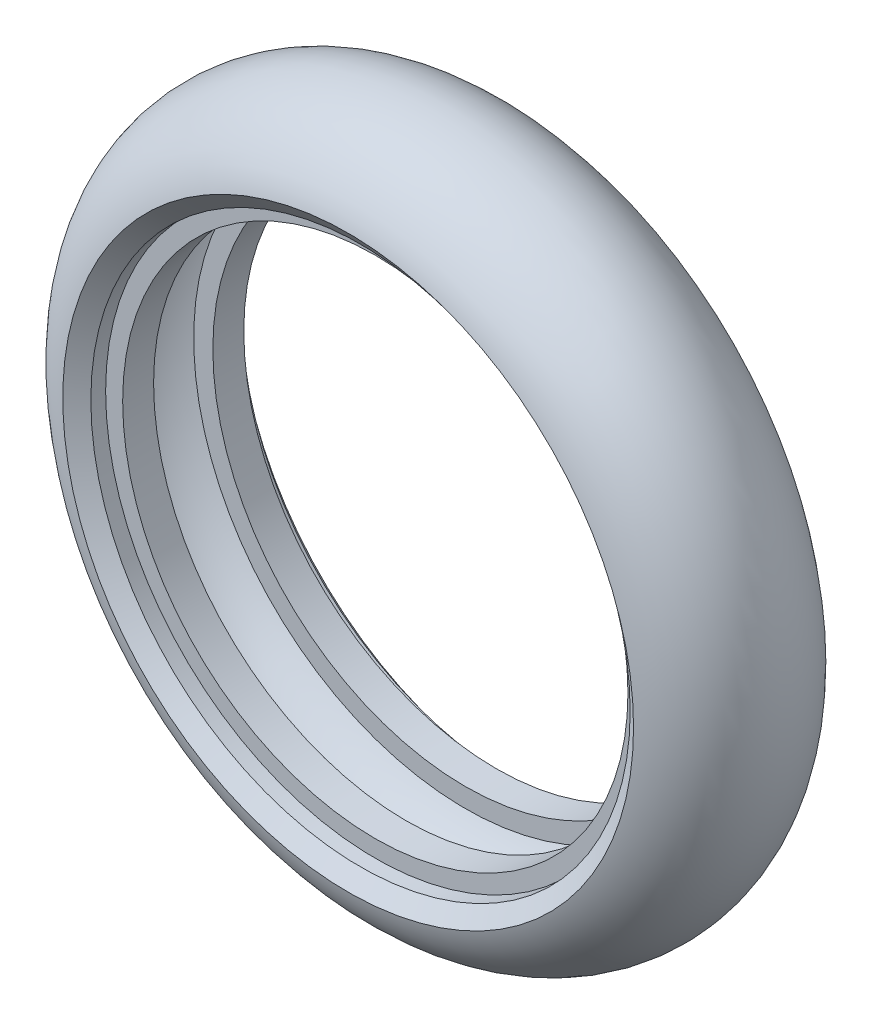
ISO-10303-21;
HEADER;
FILE_DESCRIPTION(('STEP AP214'),'2;1');
FILE_NAME('part.step','',(''),(''),'','','');
FILE_SCHEMA(('AUTOMOTIVE_DESIGN { 1 0 10303 214 1 1 1 1 }'));
ENDSEC;
DATA;
#1=APPLICATION_CONTEXT('core data for automotive mechanical design processes');
#2=APPLICATION_PROTOCOL_DEFINITION('international standard','automotive_design',2000,#1);
#3=PRODUCT_CONTEXT('',#1,'mechanical');
#4=PRODUCT('Part','Part','',(#3));
#5=PRODUCT_RELATED_PRODUCT_CATEGORY('part','',(#4));
#6=PRODUCT_DEFINITION_FORMATION('','',#4);
#7=PRODUCT_DEFINITION_CONTEXT('part definition',#1,'design');
#8=PRODUCT_DEFINITION('design','',#6,#7);
#9=PRODUCT_DEFINITION_SHAPE('','',#8);
#10=(LENGTH_UNIT() NAMED_UNIT(*) SI_UNIT(.MILLI.,.METRE.));
#11=(NAMED_UNIT(*) PLANE_ANGLE_UNIT() SI_UNIT($,.RADIAN.));
#12=(NAMED_UNIT(*) SI_UNIT($,.STERADIAN.) SOLID_ANGLE_UNIT());
#13=UNCERTAINTY_MEASURE_WITH_UNIT(LENGTH_MEASURE(1.E-05),#10,'distance_accuracy_value','');
#14=(GEOMETRIC_REPRESENTATION_CONTEXT(3) GLOBAL_UNCERTAINTY_ASSIGNED_CONTEXT((#13)) GLOBAL_UNIT_ASSIGNED_CONTEXT((#10,
#11,#12)) REPRESENTATION_CONTEXT('',''));
#15=CARTESIAN_POINT('',(0.,0.,0.));
#16=DIRECTION('',(0.,0.,1.));
#17=DIRECTION('',(1.,0.,0.));
#18=AXIS2_PLACEMENT_3D('',#15,#16,#17);
#19=CARTESIAN_POINT('',(0.,40.9970238095238,0.));
#20=DIRECTION('',(0.,0.,1.));
#21=DIRECTION('',(1.,0.,0.));
#22=AXIS2_PLACEMENT_3D('',#19,#20,#21);
#23=TOROIDAL_SURFACE('',#22,40.9970238095238,14.2529761904761);
#24=CARTESIAN_POINT('',(0.,40.9970238095238,-13.75));
#25=DIRECTION('',(0.,0.,1.));
#26=DIRECTION('',(1.,0.,0.));
#27=AXIS2_PLACEMENT_3D('',#24,#25,#26);
#28=CIRCLE('',#27,44.7499999999999);
#29=CARTESIAN_POINT('',(44.7499999999999,40.9970238095238,-13.75));
#30=VERTEX_POINT('',#29);
#31=EDGE_CURVE('E10',#30,#30,#28,.T.);
#32=ORIENTED_EDGE('',*,*,#31,.T.);
#33=EDGE_LOOP('',(#32));
#34=FACE_BOUND('',#33,.T.);
#35=CARTESIAN_POINT('',(0.,40.9970238095238,13.75));
#36=DIRECTION('',(0.,0.,1.));
#37=DIRECTION('',(1.,0.,0.));
#38=AXIS2_PLACEMENT_3D('',#35,#36,#37);
#39=CIRCLE('',#38,44.7499999999999);
#40=CARTESIAN_POINT('',(44.7499999999999,40.9970238095238,13.75));
#41=VERTEX_POINT('',#40);
#42=EDGE_CURVE('E84',#41,#41,#39,.T.);
#43=ORIENTED_EDGE('',*,*,#42,.F.);
#44=EDGE_LOOP('',(#43));
#45=FACE_BOUND('',#44,.T.);
#46=ADVANCED_FACE('F32',(#34,#45),#23,.T.);
#47=CARTESIAN_POINT('',(0.,40.9970238095238,-13.75));
#48=DIRECTION('',(0.,0.,-1.));
#49=DIRECTION('',(-1.,0.,0.));
#50=AXIS2_PLACEMENT_3D('',#47,#48,#49);
#51=CONICAL_SURFACE('',#50,44.7499999999999,0.905275158209152);
#52=CARTESIAN_POINT('',(0.,40.9970238095238,-11.815));
#53=DIRECTION('',(0.,0.,1.));
#54=DIRECTION('',(1.,0.,0.));
#55=AXIS2_PLACEMENT_3D('',#52,#53,#54);
#56=CIRCLE('',#55,42.285);
#57=CARTESIAN_POINT('',(42.285,40.9970238095238,-11.815));
#58=VERTEX_POINT('',#57);
#59=EDGE_CURVE('E38',#58,#58,#56,.T.);
#60=ORIENTED_EDGE('',*,*,#59,.T.);
#61=EDGE_LOOP('',(#60));
#62=FACE_BOUND('',#61,.T.);
#63=ORIENTED_EDGE('',*,*,#31,.F.);
#64=EDGE_LOOP('',(#63));
#65=FACE_BOUND('',#64,.T.);
#66=ADVANCED_FACE('F92',(#62,#65),#51,.F.);
#67=CARTESIAN_POINT('',(0.,40.9970238095238,83.1369947680119));
#68=DIRECTION('',(0.,0.,1.));
#69=DIRECTION('',(1.,0.,0.));
#70=AXIS2_PLACEMENT_3D('',#67,#68,#69);
#71=CYLINDRICAL_SURFACE('',#70,42.285);
#72=CARTESIAN_POINT('',(0.,40.9970238095238,-9.495));
#73=DIRECTION('',(0.,0.,1.));
#74=DIRECTION('',(1.,0.,0.));
#75=AXIS2_PLACEMENT_3D('',#72,#73,#74);
#76=CIRCLE('',#75,42.285);
#77=CARTESIAN_POINT('',(42.285,40.9970238095238,-9.495));
#78=VERTEX_POINT('',#77);
#79=EDGE_CURVE('E42',#78,#78,#76,.T.);
#80=ORIENTED_EDGE('',*,*,#79,.T.);
#81=EDGE_LOOP('',(#80));
#82=FACE_BOUND('',#81,.T.);
#83=ORIENTED_EDGE('',*,*,#59,.F.);
#84=EDGE_LOOP('',(#83));
#85=FACE_BOUND('',#84,.T.);
#86=ADVANCED_FACE('F96',(#82,#85),#71,.F.);
#87=CARTESIAN_POINT('',(0.,-1.2879761904762,-9.495));
#88=DIRECTION('',(0.,0.,-1.));
#89=DIRECTION('',(-1.,0.,0.));
#90=AXIS2_PLACEMENT_3D('',#87,#88,#89);
#91=PLANE('',#90);
#92=CARTESIAN_POINT('',(0.,40.9970238095238,-9.495));
#93=DIRECTION('',(0.,0.,1.));
#94=DIRECTION('',(1.,0.,0.));
#95=AXIS2_PLACEMENT_3D('',#92,#93,#94);
#96=CIRCLE('',#95,39.615);
#97=CARTESIAN_POINT('',(39.615,40.9970238095238,-9.495));
#98=VERTEX_POINT('',#97);
#99=EDGE_CURVE('E46',#98,#98,#96,.T.);
#100=ORIENTED_EDGE('',*,*,#99,.T.);
#101=EDGE_LOOP('',(#100));
#102=FACE_BOUND('',#101,.T.);
#103=ORIENTED_EDGE('',*,*,#79,.F.);
#104=EDGE_LOOP('',(#103));
#105=FACE_BOUND('',#104,.T.);
#106=ADVANCED_FACE('F100',(#102,#105),#91,.T.);
#107=CARTESIAN_POINT('',(0.,40.9970238095238,83.1369947680119));
#108=DIRECTION('',(0.,0.,1.));
#109=DIRECTION('',(1.,0.,0.));
#110=AXIS2_PLACEMENT_3D('',#107,#108,#109);
#111=CYLINDRICAL_SURFACE('',#110,39.615);
#112=CARTESIAN_POINT('',(0.,40.9970238095238,-4.645));
#113=DIRECTION('',(0.,0.,1.));
#114=DIRECTION('',(1.,0.,0.));
#115=AXIS2_PLACEMENT_3D('',#112,#113,#114);
#116=CIRCLE('',#115,39.615);
#117=CARTESIAN_POINT('',(39.615,40.9970238095238,-4.645));
#118=VERTEX_POINT('',#117);
#119=EDGE_CURVE('E51',#118,#118,#116,.T.);
#120=ORIENTED_EDGE('',*,*,#119,.T.);
#121=EDGE_LOOP('',(#120));
#122=FACE_BOUND('',#121,.T.);
#123=ORIENTED_EDGE('',*,*,#99,.F.);
#124=EDGE_LOOP('',(#123));
#125=FACE_BOUND('',#124,.T.);
#126=ADVANCED_FACE('F107',(#122,#125),#111,.F.);
#127=CARTESIAN_POINT('',(0.,1.38202380952381,-4.645));
#128=DIRECTION('',(0.,0.,1.));
#129=DIRECTION('',(1.,0.,0.));
#130=AXIS2_PLACEMENT_3D('',#127,#128,#129);
#131=PLANE('',#130);
#132=CARTESIAN_POINT('',(0.,40.9970238095238,-4.645));
#133=DIRECTION('',(0.,0.,1.));
#134=DIRECTION('',(1.,0.,0.));
#135=AXIS2_PLACEMENT_3D('',#132,#133,#134);
#136=CIRCLE('',#135,42.615);
#137=CARTESIAN_POINT('',(42.615,40.9970238095238,-4.645));
#138=VERTEX_POINT('',#137);
#139=EDGE_CURVE('E54',#138,#138,#136,.T.);
#140=ORIENTED_EDGE('',*,*,#139,.T.);
#141=EDGE_LOOP('',(#140));
#142=FACE_BOUND('',#141,.T.);
#143=ORIENTED_EDGE('',*,*,#119,.F.);
#144=EDGE_LOOP('',(#143));
#145=FACE_BOUND('',#144,.T.);
#146=ADVANCED_FACE('F111',(#142,#145),#131,.T.);
#147=CARTESIAN_POINT('',(0.,40.9970238095238,-4.645));
#148=DIRECTION('',(0.,0.,-1.));
#149=DIRECTION('',(-1.,0.,0.));
#150=AXIS2_PLACEMENT_3D('',#147,#148,#149);
#151=CONICAL_SURFACE('',#150,42.615,0.160300927092976);
#152=CARTESIAN_POINT('',(0.,40.9970238095238,-10.2418098271248));
#153=DIRECTION('',(0.,0.,1.));
#154=DIRECTION('',(1.,0.,0.));
#155=AXIS2_PLACEMENT_3D('',#152,#153,#154);
#156=CIRCLE('',#155,43.5199383304315);
#157=CARTESIAN_POINT('',(43.5199383304315,40.9970238095238,-10.2418098271248));
#158=VERTEX_POINT('',#157);
#159=EDGE_CURVE('E57',#158,#158,#156,.T.);
#160=ORIENTED_EDGE('',*,*,#159,.T.);
#161=EDGE_LOOP('',(#160));
#162=FACE_BOUND('',#161,.T.);
#163=ORIENTED_EDGE('',*,*,#139,.F.);
#164=EDGE_LOOP('',(#163));
#165=FACE_BOUND('',#164,.T.);
#166=ADVANCED_FACE('F115',(#162,#165),#151,.T.);
#167=CARTESIAN_POINT('',(0.,40.9970238095238,-10.2418098271248));
#168=DIRECTION('',(0.,0.,-1.));
#169=DIRECTION('',(-1.,0.,0.));
#170=AXIS2_PLACEMENT_3D('',#167,#168,#169);
#171=CONICAL_SURFACE('',#170,43.5199383304315,0.905275158209181);
#172=CARTESIAN_POINT('',(0.,40.9970238095238,-11.5257248986512));
#173=DIRECTION('',(0.,0.,1.));
#174=DIRECTION('',(1.,0.,0.));
#175=AXIS2_PLACEMENT_3D('',#172,#173,#174);
#176=CIRCLE('',#175,45.1555200623761);
#177=CARTESIAN_POINT('',(45.1555200623761,40.9970238095238,-11.5257248986512));
#178=VERTEX_POINT('',#177);
#179=EDGE_CURVE('E60',#178,#178,#176,.T.);
#180=ORIENTED_EDGE('',*,*,#179,.T.);
#181=EDGE_LOOP('',(#180));
#182=FACE_BOUND('',#181,.T.);
#183=ORIENTED_EDGE('',*,*,#159,.F.);
#184=EDGE_LOOP('',(#183));
#185=FACE_BOUND('',#184,.T.);
#186=ADVANCED_FACE('F119',(#182,#185),#171,.T.);
#187=CARTESIAN_POINT('',(0.,40.9970238095238,0.));
#188=DIRECTION('',(0.,0.,1.));
#189=DIRECTION('',(1.,0.,0.));
#190=AXIS2_PLACEMENT_3D('',#187,#188,#189);
#191=TOROIDAL_SURFACE('',#190,40.9970238095238,12.2529761904761);
#192=CARTESIAN_POINT('',(0.,40.9970238095238,11.5257248986513));
#193=DIRECTION('',(0.,0.,1.));
#194=DIRECTION('',(1.,0.,0.));
#195=AXIS2_PLACEMENT_3D('',#192,#193,#194);
#196=CIRCLE('',#195,45.1555200623761);
#197=CARTESIAN_POINT('',(45.1555200623761,40.9970238095238,11.5257248986513));
#198=VERTEX_POINT('',#197);
#199=EDGE_CURVE('E63',#198,#198,#196,.T.);
#200=ORIENTED_EDGE('',*,*,#199,.T.);
#201=EDGE_LOOP('',(#200));
#202=FACE_BOUND('',#201,.T.);
#203=ORIENTED_EDGE('',*,*,#179,.F.);
#204=EDGE_LOOP('',(#203));
#205=FACE_BOUND('',#204,.T.);
#206=ADVANCED_FACE('F123',(#202,#205),#191,.F.);
#207=CARTESIAN_POINT('',(0.,40.9970238095238,11.5257248986513));
#208=DIRECTION('',(0.,0.,1.));
#209=DIRECTION('',(1.,0.,0.));
#210=AXIS2_PLACEMENT_3D('',#207,#208,#209);
#211=CONICAL_SURFACE('',#210,45.1555200623761,0.90527515820917);
#212=CARTESIAN_POINT('',(0.,40.9970238095238,10.2418098271248));
#213=DIRECTION('',(0.,0.,1.));
#214=DIRECTION('',(1.,0.,0.));
#215=AXIS2_PLACEMENT_3D('',#212,#213,#214);
#216=CIRCLE('',#215,43.5199383304315);
#217=CARTESIAN_POINT('',(43.5199383304315,40.9970238095238,10.2418098271248));
#218=VERTEX_POINT('',#217);
#219=EDGE_CURVE('E66',#218,#218,#216,.T.);
#220=ORIENTED_EDGE('',*,*,#219,.T.);
#221=EDGE_LOOP('',(#220));
#222=FACE_BOUND('',#221,.T.);
#223=ORIENTED_EDGE('',*,*,#199,.F.);
#224=EDGE_LOOP('',(#223));
#225=FACE_BOUND('',#224,.T.);
#226=ADVANCED_FACE('F127',(#222,#225),#211,.T.);
#227=CARTESIAN_POINT('',(0.,40.9970238095238,10.2418098271248));
#228=DIRECTION('',(0.,0.,1.));
#229=DIRECTION('',(1.,0.,0.));
#230=AXIS2_PLACEMENT_3D('',#227,#228,#229);
#231=CONICAL_SURFACE('',#230,43.5199383304315,0.160300927092976);
#232=CARTESIAN_POINT('',(0.,40.9970238095238,4.645));
#233=DIRECTION('',(0.,0.,1.));
#234=DIRECTION('',(1.,0.,0.));
#235=AXIS2_PLACEMENT_3D('',#232,#233,#234);
#236=CIRCLE('',#235,42.615);
#237=CARTESIAN_POINT('',(42.615,40.9970238095238,4.645));
#238=VERTEX_POINT('',#237);
#239=EDGE_CURVE('E69',#238,#238,#236,.T.);
#240=ORIENTED_EDGE('',*,*,#239,.T.);
#241=EDGE_LOOP('',(#240));
#242=FACE_BOUND('',#241,.T.);
#243=ORIENTED_EDGE('',*,*,#219,.F.);
#244=EDGE_LOOP('',(#243));
#245=FACE_BOUND('',#244,.T.);
#246=ADVANCED_FACE('F131',(#242,#245),#231,.T.);
#247=CARTESIAN_POINT('',(0.,1.38202380952381,4.645));
#248=DIRECTION('',(0.,0.,-1.));
#249=DIRECTION('',(-1.,0.,0.));
#250=AXIS2_PLACEMENT_3D('',#247,#248,#249);
#251=PLANE('',#250);
#252=CARTESIAN_POINT('',(0.,40.9970238095238,4.645));
#253=DIRECTION('',(0.,0.,1.));
#254=DIRECTION('',(1.,0.,0.));
#255=AXIS2_PLACEMENT_3D('',#252,#253,#254);
#256=CIRCLE('',#255,39.615);
#257=CARTESIAN_POINT('',(39.615,40.9970238095238,4.645));
#258=VERTEX_POINT('',#257);
#259=EDGE_CURVE('E72',#258,#258,#256,.T.);
#260=ORIENTED_EDGE('',*,*,#259,.T.);
#261=EDGE_LOOP('',(#260));
#262=FACE_BOUND('',#261,.T.);
#263=ORIENTED_EDGE('',*,*,#239,.F.);
#264=EDGE_LOOP('',(#263));
#265=FACE_BOUND('',#264,.T.);
#266=ADVANCED_FACE('F135',(#262,#265),#251,.T.);
#267=CARTESIAN_POINT('',(0.,40.9970238095238,83.1369947680119));
#268=DIRECTION('',(0.,0.,1.));
#269=DIRECTION('',(1.,0.,0.));
#270=AXIS2_PLACEMENT_3D('',#267,#268,#269);
#271=CYLINDRICAL_SURFACE('',#270,39.615);
#272=CARTESIAN_POINT('',(0.,40.9970238095238,9.495));
#273=DIRECTION('',(0.,0.,1.));
#274=DIRECTION('',(1.,0.,0.));
#275=AXIS2_PLACEMENT_3D('',#272,#273,#274);
#276=CIRCLE('',#275,39.615);
#277=CARTESIAN_POINT('',(39.615,40.9970238095238,9.495));
#278=VERTEX_POINT('',#277);
#279=EDGE_CURVE('E75',#278,#278,#276,.T.);
#280=ORIENTED_EDGE('',*,*,#279,.T.);
#281=EDGE_LOOP('',(#280));
#282=FACE_BOUND('',#281,.T.);
#283=ORIENTED_EDGE('',*,*,#259,.F.);
#284=EDGE_LOOP('',(#283));
#285=FACE_BOUND('',#284,.T.);
#286=ADVANCED_FACE('F139',(#282,#285),#271,.F.);
#287=CARTESIAN_POINT('',(0.,-1.2879761904762,9.495));
#288=DIRECTION('',(0.,0.,1.));
#289=DIRECTION('',(1.,0.,0.));
#290=AXIS2_PLACEMENT_3D('',#287,#288,#289);
#291=PLANE('',#290);
#292=CARTESIAN_POINT('',(0.,40.9970238095238,9.495));
#293=DIRECTION('',(0.,0.,1.));
#294=DIRECTION('',(1.,0.,0.));
#295=AXIS2_PLACEMENT_3D('',#292,#293,#294);
#296=CIRCLE('',#295,42.285);
#297=CARTESIAN_POINT('',(42.285,40.9970238095238,9.495));
#298=VERTEX_POINT('',#297);
#299=EDGE_CURVE('E78',#298,#298,#296,.T.);
#300=ORIENTED_EDGE('',*,*,#299,.T.);
#301=EDGE_LOOP('',(#300));
#302=FACE_BOUND('',#301,.T.);
#303=ORIENTED_EDGE('',*,*,#279,.F.);
#304=EDGE_LOOP('',(#303));
#305=FACE_BOUND('',#304,.T.);
#306=ADVANCED_FACE('F143',(#302,#305),#291,.T.);
#307=CARTESIAN_POINT('',(0.,40.9970238095238,83.1369947680119));
#308=DIRECTION('',(0.,0.,1.));
#309=DIRECTION('',(1.,0.,0.));
#310=AXIS2_PLACEMENT_3D('',#307,#308,#309);
#311=CYLINDRICAL_SURFACE('',#310,42.285);
#312=CARTESIAN_POINT('',(0.,40.9970238095238,11.815));
#313=DIRECTION('',(0.,0.,1.));
#314=DIRECTION('',(1.,0.,0.));
#315=AXIS2_PLACEMENT_3D('',#312,#313,#314);
#316=CIRCLE('',#315,42.285);
#317=CARTESIAN_POINT('',(42.285,40.9970238095238,11.815));
#318=VERTEX_POINT('',#317);
#319=EDGE_CURVE('E81',#318,#318,#316,.T.);
#320=ORIENTED_EDGE('',*,*,#319,.T.);
#321=EDGE_LOOP('',(#320));
#322=FACE_BOUND('',#321,.T.);
#323=ORIENTED_EDGE('',*,*,#299,.F.);
#324=EDGE_LOOP('',(#323));
#325=FACE_BOUND('',#324,.T.);
#326=ADVANCED_FACE('F147',(#322,#325),#311,.F.);
#327=CARTESIAN_POINT('',(0.,40.9970238095238,11.815));
#328=DIRECTION('',(0.,0.,1.));
#329=DIRECTION('',(1.,0.,0.));
#330=AXIS2_PLACEMENT_3D('',#327,#328,#329);
#331=CONICAL_SURFACE('',#330,42.285,0.905275158209152);
#332=ORIENTED_EDGE('',*,*,#42,.T.);
#333=EDGE_LOOP('',(#332));
#334=FACE_BOUND('',#333,.T.);
#335=ORIENTED_EDGE('',*,*,#319,.F.);
#336=EDGE_LOOP('',(#335));
#337=FACE_BOUND('',#336,.T.);
#338=ADVANCED_FACE('F88',(#334,#337),#331,.F.);
#339=CLOSED_SHELL('',(#46,#66,#86,#106,#126,#146,#166,#186,#206,#226,#246,#266,#286,#306,#326,#338));
#340=MANIFOLD_SOLID_BREP('B2',#339);
#341=ADVANCED_BREP_SHAPE_REPRESENTATION('',(#18,#340),#14);
#342=SHAPE_DEFINITION_REPRESENTATION(#9,#341);
ENDSEC;
END-ISO-10303-21;
